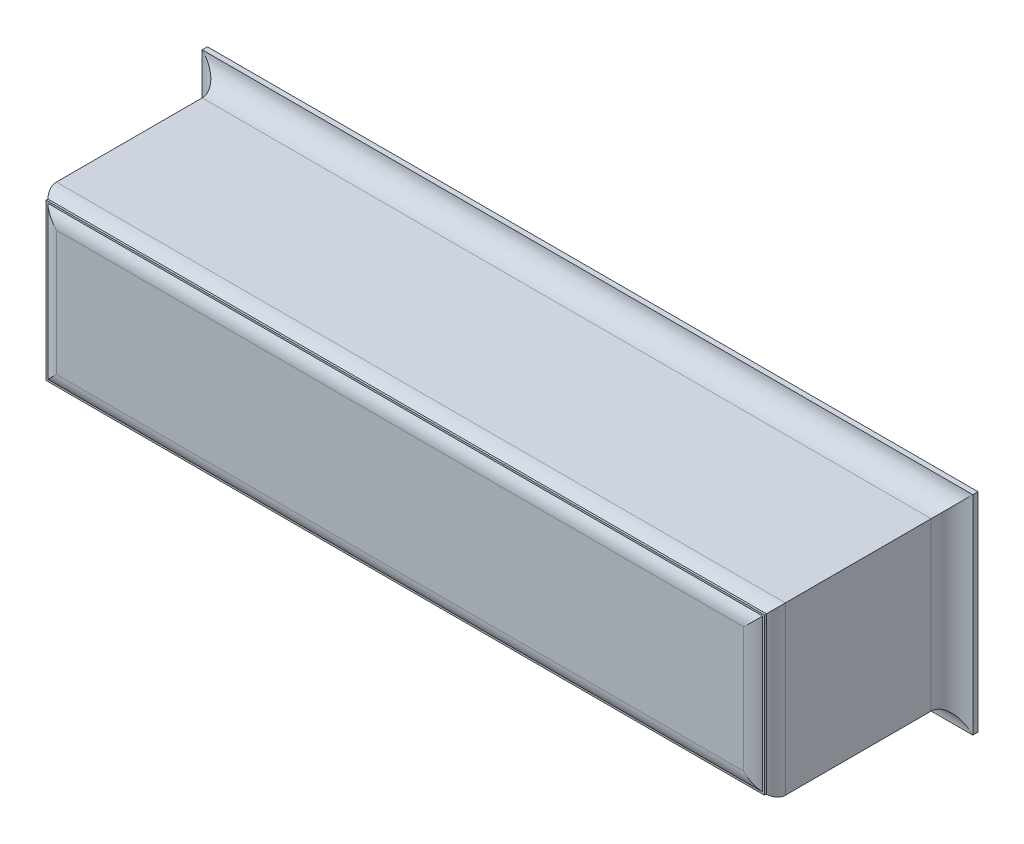
ISO-10303-21;
HEADER;
FILE_DESCRIPTION(('STEP AP214'),'2;1');
FILE_NAME('part.step','',(''),(''),'','','');
FILE_SCHEMA(('AUTOMOTIVE_DESIGN { 1 0 10303 214 1 1 1 1 }'));
ENDSEC;
DATA;
#1=APPLICATION_CONTEXT('core data for automotive mechanical design processes');
#2=APPLICATION_PROTOCOL_DEFINITION('international standard','automotive_design',2000,#1);
#3=PRODUCT_CONTEXT('',#1,'mechanical');
#4=PRODUCT('Part','Part','',(#3));
#5=PRODUCT_RELATED_PRODUCT_CATEGORY('part','',(#4));
#6=PRODUCT_DEFINITION_FORMATION('','',#4);
#7=PRODUCT_DEFINITION_CONTEXT('part definition',#1,'design');
#8=PRODUCT_DEFINITION('design','',#6,#7);
#9=PRODUCT_DEFINITION_SHAPE('','',#8);
#10=(LENGTH_UNIT() NAMED_UNIT(*) SI_UNIT(.MILLI.,.METRE.));
#11=(NAMED_UNIT(*) PLANE_ANGLE_UNIT() SI_UNIT($,.RADIAN.));
#12=(NAMED_UNIT(*) SI_UNIT($,.STERADIAN.) SOLID_ANGLE_UNIT());
#13=UNCERTAINTY_MEASURE_WITH_UNIT(LENGTH_MEASURE(1.E-05),#10,'distance_accuracy_value','');
#14=(GEOMETRIC_REPRESENTATION_CONTEXT(3) GLOBAL_UNCERTAINTY_ASSIGNED_CONTEXT((#13)) GLOBAL_UNIT_ASSIGNED_CONTEXT((#10,
#11,#12)) REPRESENTATION_CONTEXT('',''));
#15=CARTESIAN_POINT('',(0.,0.,0.));
#16=DIRECTION('',(0.,0.,1.));
#17=DIRECTION('',(1.,0.,0.));
#18=AXIS2_PLACEMENT_3D('',#15,#16,#17);
#19=CARTESIAN_POINT('',(234.95,63.5,-3.175));
#20=DIRECTION('',(-1.,0.,0.));
#21=DIRECTION('',(0.,-1.,0.));
#22=AXIS2_PLACEMENT_3D('',#19,#20,#21);
#23=PLANE('',#22);
#24=DIRECTION('',(0.,-1.,0.));
#25=VECTOR('',#24,1.);
#26=CARTESIAN_POINT('',(234.95,63.5,0.));
#27=LINE('',#26,#25);
#28=CARTESIAN_POINT('',(234.95,63.5,0.));
#29=VERTEX_POINT('',#28);
#30=CARTESIAN_POINT('',(234.95,-63.5000000000001,0.));
#31=VERTEX_POINT('',#30);
#32=EDGE_CURVE('E207',#29,#31,#27,.T.);
#33=ORIENTED_EDGE('',*,*,#32,.T.);
#34=DIRECTION('',(0.,0.,1.));
#35=VECTOR('',#34,1.);
#36=CARTESIAN_POINT('',(234.95,-63.5000000000001,-3.175));
#37=LINE('',#36,#35);
#38=CARTESIAN_POINT('',(234.95,-63.5000000000001,-3.175));
#39=VERTEX_POINT('',#38);
#40=EDGE_CURVE('E223',#39,#31,#37,.T.);
#41=ORIENTED_EDGE('',*,*,#40,.F.);
#42=DIRECTION('',(0.,-1.,0.));
#43=VECTOR('',#42,1.);
#44=CARTESIAN_POINT('',(234.95,63.5,-3.175));
#45=LINE('',#44,#43);
#46=CARTESIAN_POINT('',(234.95,63.5,-3.175));
#47=VERTEX_POINT('',#46);
#48=EDGE_CURVE('E196',#47,#39,#45,.T.);
#49=ORIENTED_EDGE('',*,*,#48,.F.);
#50=DIRECTION('',(0.,0.,1.));
#51=VECTOR('',#50,1.);
#52=CARTESIAN_POINT('',(234.95,63.5,-3.175));
#53=LINE('',#52,#51);
#54=EDGE_CURVE('E206',#47,#29,#53,.T.);
#55=ORIENTED_EDGE('',*,*,#54,.T.);
#56=EDGE_LOOP('',(#33,#41,#49,#55));
#57=FACE_BOUND('',#56,.T.);
#58=ADVANCED_FACE('F36',(#57),#23,.F.);
#59=CARTESIAN_POINT('',(-234.95,-63.5,-3.175));
#60=DIRECTION('',(0.,1.,0.));
#61=DIRECTION('',(-1.,0.,0.));
#62=AXIS2_PLACEMENT_3D('',#59,#60,#61);
#63=PLANE('',#62);
#64=DIRECTION('',(-1.,0.,0.));
#65=VECTOR('',#64,1.);
#66=CARTESIAN_POINT('',(-234.95,-63.5,0.));
#67=LINE('',#66,#65);
#68=CARTESIAN_POINT('',(-234.95,-63.5,0.));
#69=VERTEX_POINT('',#68);
#70=EDGE_CURVE('E210',#31,#69,#67,.T.);
#71=ORIENTED_EDGE('',*,*,#70,.T.);
#72=DIRECTION('',(0.,0.,1.));
#73=VECTOR('',#72,1.);
#74=CARTESIAN_POINT('',(-234.95,-63.5,-3.175));
#75=LINE('',#74,#73);
#76=CARTESIAN_POINT('',(-234.95,-63.5,-3.175));
#77=VERTEX_POINT('',#76);
#78=EDGE_CURVE('E220',#77,#69,#75,.T.);
#79=ORIENTED_EDGE('',*,*,#78,.F.);
#80=DIRECTION('',(-1.,0.,0.));
#81=VECTOR('',#80,1.);
#82=CARTESIAN_POINT('',(-234.95,-63.5,-3.175));
#83=LINE('',#82,#81);
#84=EDGE_CURVE('E199',#39,#77,#83,.T.);
#85=ORIENTED_EDGE('',*,*,#84,.F.);
#86=ORIENTED_EDGE('',*,*,#40,.T.);
#87=EDGE_LOOP('',(#71,#79,#85,#86));
#88=FACE_BOUND('',#87,.T.);
#89=ADVANCED_FACE('F330',(#88),#63,.F.);
#90=CARTESIAN_POINT('',(-234.95,63.5,-3.175));
#91=DIRECTION('',(1.,0.,0.));
#92=DIRECTION('',(0.,1.,0.));
#93=AXIS2_PLACEMENT_3D('',#90,#91,#92);
#94=PLANE('',#93);
#95=DIRECTION('',(0.,1.,0.));
#96=VECTOR('',#95,1.);
#97=CARTESIAN_POINT('',(-234.95,63.5,0.));
#98=LINE('',#97,#96);
#99=CARTESIAN_POINT('',(-234.95,63.5,0.));
#100=VERTEX_POINT('',#99);
#101=EDGE_CURVE('E212',#69,#100,#98,.T.);
#102=ORIENTED_EDGE('',*,*,#101,.T.);
#103=DIRECTION('',(0.,0.,1.));
#104=VECTOR('',#103,1.);
#105=CARTESIAN_POINT('',(-234.95,63.5,-3.175));
#106=LINE('',#105,#104);
#107=CARTESIAN_POINT('',(-234.95,63.5,-3.175));
#108=VERTEX_POINT('',#107);
#109=EDGE_CURVE('E217',#108,#100,#106,.T.);
#110=ORIENTED_EDGE('',*,*,#109,.F.);
#111=DIRECTION('',(0.,1.,0.));
#112=VECTOR('',#111,1.);
#113=CARTESIAN_POINT('',(-234.95,63.5,-3.175));
#114=LINE('',#113,#112);
#115=EDGE_CURVE('E202',#77,#108,#114,.T.);
#116=ORIENTED_EDGE('',*,*,#115,.F.);
#117=ORIENTED_EDGE('',*,*,#78,.T.);
#118=EDGE_LOOP('',(#102,#110,#116,#117));
#119=FACE_BOUND('',#118,.T.);
#120=ADVANCED_FACE('F318',(#119),#94,.F.);
#121=CARTESIAN_POINT('',(-234.95,63.5,-3.175));
#122=DIRECTION('',(0.,-1.,0.));
#123=DIRECTION('',(1.,0.,0.));
#124=AXIS2_PLACEMENT_3D('',#121,#122,#123);
#125=PLANE('',#124);
#126=DIRECTION('',(1.,0.,0.));
#127=VECTOR('',#126,1.);
#128=CARTESIAN_POINT('',(-234.95,63.5,0.));
#129=LINE('',#128,#127);
#130=EDGE_CURVE('E200',#100,#29,#129,.T.);
#131=ORIENTED_EDGE('',*,*,#130,.T.);
#132=ORIENTED_EDGE('',*,*,#54,.F.);
#133=DIRECTION('',(1.,0.,0.));
#134=VECTOR('',#133,1.);
#135=CARTESIAN_POINT('',(-234.95,63.5,-3.175));
#136=LINE('',#135,#134);
#137=EDGE_CURVE('E204',#108,#47,#136,.T.);
#138=ORIENTED_EDGE('',*,*,#137,.F.);
#139=ORIENTED_EDGE('',*,*,#109,.T.);
#140=EDGE_LOOP('',(#131,#132,#138,#139));
#141=FACE_BOUND('',#140,.T.);
#142=ADVANCED_FACE('F323',(#141),#125,.F.);
#143=CARTESIAN_POINT('',(0.,0.,-3.175));
#144=DIRECTION('',(0.,0.,1.));
#145=DIRECTION('',(1.,0.,0.));
#146=AXIS2_PLACEMENT_3D('',#143,#144,#145);
#147=PLANE('',#146);
#148=ORIENTED_EDGE('',*,*,#48,.T.);
#149=ORIENTED_EDGE('',*,*,#84,.T.);
#150=ORIENTED_EDGE('',*,*,#115,.T.);
#151=ORIENTED_EDGE('',*,*,#137,.T.);
#152=EDGE_LOOP('',(#148,#149,#150,#151));
#153=FACE_BOUND('',#152,.T.);
#154=ADVANCED_FACE('F327',(#153),#147,.F.);
#155=CARTESIAN_POINT('',(222.25,-50.8,57.15));
#156=DIRECTION('',(0.,1.,0.));
#157=DIRECTION('',(-1.,0.,0.));
#158=AXIS2_PLACEMENT_3D('',#155,#156,#157);
#159=PLANE('',#158);
#160=DIRECTION('',(0.,0.,-1.));
#161=VECTOR('',#160,1.);
#162=CARTESIAN_POINT('',(-222.25,-50.8,57.15));
#163=LINE('',#162,#161);
#164=CARTESIAN_POINT('',(-222.25,-50.8,101.6));
#165=VERTEX_POINT('',#164);
#166=CARTESIAN_POINT('',(-222.25,-50.8,12.7));
#167=VERTEX_POINT('',#166);
#168=EDGE_CURVE('E265',#165,#167,#163,.T.);
#169=ORIENTED_EDGE('',*,*,#168,.T.);
#170=DIRECTION('',(1.,0.,0.));
#171=VECTOR('',#170,1.);
#172=CARTESIAN_POINT('',(222.25,-50.8,12.7));
#173=LINE('',#172,#171);
#174=CARTESIAN_POINT('',(222.25,-50.8,12.7));
#175=VERTEX_POINT('',#174);
#176=EDGE_CURVE('E11',#167,#175,#173,.T.);
#177=ORIENTED_EDGE('',*,*,#176,.T.);
#178=DIRECTION('',(0.,0.,-1.));
#179=VECTOR('',#178,1.);
#180=CARTESIAN_POINT('',(222.25,-50.8,57.15));
#181=LINE('',#180,#179);
#182=CARTESIAN_POINT('',(222.25,-50.8,101.6));
#183=VERTEX_POINT('',#182);
#184=EDGE_CURVE('E262',#183,#175,#181,.T.);
#185=ORIENTED_EDGE('',*,*,#184,.F.);
#186=DIRECTION('',(1.,0.,0.));
#187=VECTOR('',#186,1.);
#188=CARTESIAN_POINT('',(-222.25,-50.8,101.6));
#189=LINE('',#188,#187);
#190=EDGE_CURVE('E276',#183,#165,#189,.F.);
#191=ORIENTED_EDGE('',*,*,#190,.T.);
#192=EDGE_LOOP('',(#169,#177,#185,#191));
#193=FACE_BOUND('',#192,.T.);
#194=ADVANCED_FACE('F364',(#193),#159,.F.);
#195=CARTESIAN_POINT('',(222.25,-50.8,57.15));
#196=DIRECTION('',(-1.,0.,0.));
#197=DIRECTION('',(0.,0.,1.));
#198=AXIS2_PLACEMENT_3D('',#195,#196,#197);
#199=PLANE('',#198);
#200=ORIENTED_EDGE('',*,*,#184,.T.);
#201=DIRECTION('',(0.,1.,0.));
#202=VECTOR('',#201,1.);
#203=CARTESIAN_POINT('',(222.25,-50.8,12.7));
#204=LINE('',#203,#202);
#205=CARTESIAN_POINT('',(222.25,50.8,12.7));
#206=VERTEX_POINT('',#205);
#207=EDGE_CURVE('E285',#175,#206,#204,.T.);
#208=ORIENTED_EDGE('',*,*,#207,.T.);
#209=DIRECTION('',(0.,0.,-1.));
#210=VECTOR('',#209,1.);
#211=CARTESIAN_POINT('',(222.25,50.8,57.15));
#212=LINE('',#211,#210);
#213=CARTESIAN_POINT('',(222.25,50.8,101.6));
#214=VERTEX_POINT('',#213);
#215=EDGE_CURVE('E260',#214,#206,#212,.T.);
#216=ORIENTED_EDGE('',*,*,#215,.F.);
#217=DIRECTION('',(0.,-1.,0.));
#218=VECTOR('',#217,1.);
#219=CARTESIAN_POINT('',(222.25,-50.8,101.6));
#220=LINE('',#219,#218);
#221=EDGE_CURVE('E283',#214,#183,#220,.T.);
#222=ORIENTED_EDGE('',*,*,#221,.T.);
#223=EDGE_LOOP('',(#200,#208,#216,#222));
#224=FACE_BOUND('',#223,.T.);
#225=ADVANCED_FACE('F340',(#224),#199,.F.);
#226=CARTESIAN_POINT('',(222.25,50.8,57.15));
#227=DIRECTION('',(0.,-1.,0.));
#228=DIRECTION('',(1.,0.,0.));
#229=AXIS2_PLACEMENT_3D('',#226,#227,#228);
#230=PLANE('',#229);
#231=ORIENTED_EDGE('',*,*,#215,.T.);
#232=DIRECTION('',(-1.,0.,0.));
#233=VECTOR('',#232,1.);
#234=CARTESIAN_POINT('',(222.25,50.8,12.7));
#235=LINE('',#234,#233);
#236=CARTESIAN_POINT('',(-222.25,50.8,12.7));
#237=VERTEX_POINT('',#236);
#238=EDGE_CURVE('E61',#206,#237,#235,.T.);
#239=ORIENTED_EDGE('',*,*,#238,.T.);
#240=DIRECTION('',(0.,0.,-1.));
#241=VECTOR('',#240,1.);
#242=CARTESIAN_POINT('',(-222.25,50.8,57.15));
#243=LINE('',#242,#241);
#244=CARTESIAN_POINT('',(-222.25,50.8,101.6));
#245=VERTEX_POINT('',#244);
#246=EDGE_CURVE('E230',#245,#237,#243,.T.);
#247=ORIENTED_EDGE('',*,*,#246,.F.);
#248=DIRECTION('',(1.,0.,0.));
#249=VECTOR('',#248,1.);
#250=CARTESIAN_POINT('',(222.25,50.8,101.6));
#251=LINE('',#250,#249);
#252=EDGE_CURVE('E281',#245,#214,#251,.T.);
#253=ORIENTED_EDGE('',*,*,#252,.T.);
#254=EDGE_LOOP('',(#231,#239,#247,#253));
#255=FACE_BOUND('',#254,.T.);
#256=ADVANCED_FACE('F343',(#255),#230,.F.);
#257=CARTESIAN_POINT('',(-222.25,-50.8,57.15));
#258=DIRECTION('',(1.,0.,0.));
#259=DIRECTION('',(0.,0.,-1.));
#260=AXIS2_PLACEMENT_3D('',#257,#258,#259);
#261=PLANE('',#260);
#262=ORIENTED_EDGE('',*,*,#246,.T.);
#263=DIRECTION('',(0.,-1.,0.));
#264=VECTOR('',#263,1.);
#265=CARTESIAN_POINT('',(-222.25,-50.8,12.7));
#266=LINE('',#265,#264);
#267=EDGE_CURVE('E46',#237,#167,#266,.T.);
#268=ORIENTED_EDGE('',*,*,#267,.T.);
#269=ORIENTED_EDGE('',*,*,#168,.F.);
#270=DIRECTION('',(0.,1.,0.));
#271=VECTOR('',#270,1.);
#272=CARTESIAN_POINT('',(-222.25,50.8,101.6));
#273=LINE('',#272,#271);
#274=EDGE_CURVE('E279',#165,#245,#273,.T.);
#275=ORIENTED_EDGE('',*,*,#274,.T.);
#276=EDGE_LOOP('',(#262,#268,#269,#275));
#277=FACE_BOUND('',#276,.T.);
#278=ADVANCED_FACE('F412',(#277),#261,.F.);
#279=CARTESIAN_POINT('',(-338.820504416855,0.,114.3));
#280=DIRECTION('',(0.,0.,1.));
#281=DIRECTION('',(1.,0.,0.));
#282=AXIS2_PLACEMENT_3D('',#279,#280,#281);
#283=PLANE('',#282);
#284=DIRECTION('',(0.,1.,0.));
#285=VECTOR('',#284,1.);
#286=CARTESIAN_POINT('',(-209.55,-50.8,114.3));
#287=LINE('',#286,#285);
#288=CARTESIAN_POINT('',(-209.55,38.1,114.3));
#289=VERTEX_POINT('',#288);
#290=CARTESIAN_POINT('',(-209.55,-38.1,114.3));
#291=VERTEX_POINT('',#290);
#292=EDGE_CURVE('E271',#289,#291,#287,.F.);
#293=ORIENTED_EDGE('',*,*,#292,.T.);
#294=DIRECTION('',(1.,0.,0.));
#295=VECTOR('',#294,1.);
#296=CARTESIAN_POINT('',(222.25,-38.1,114.3));
#297=LINE('',#296,#295);
#298=CARTESIAN_POINT('',(209.55,-38.1,114.3));
#299=VERTEX_POINT('',#298);
#300=EDGE_CURVE('E273',#291,#299,#297,.T.);
#301=ORIENTED_EDGE('',*,*,#300,.T.);
#302=DIRECTION('',(0.,-1.,0.));
#303=VECTOR('',#302,1.);
#304=CARTESIAN_POINT('',(209.55,50.8,114.3));
#305=LINE('',#304,#303);
#306=CARTESIAN_POINT('',(209.55,38.1,114.3));
#307=VERTEX_POINT('',#306);
#308=EDGE_CURVE('E267',#299,#307,#305,.F.);
#309=ORIENTED_EDGE('',*,*,#308,.T.);
#310=DIRECTION('',(1.,0.,0.));
#311=VECTOR('',#310,1.);
#312=CARTESIAN_POINT('',(-222.25,38.1,114.3));
#313=LINE('',#312,#311);
#314=EDGE_CURVE('E269',#307,#289,#313,.F.);
#315=ORIENTED_EDGE('',*,*,#314,.T.);
#316=EDGE_LOOP('',(#293,#301,#309,#315));
#317=FACE_BOUND('',#316,.T.);
#318=ADVANCED_FACE('F357',(#317),#283,.T.);
#319=CARTESIAN_POINT('',(222.25,38.1,101.6));
#320=DIRECTION('',(-1.,0.,0.));
#321=DIRECTION('',(0.,-1.,0.));
#322=AXIS2_PLACEMENT_3D('',#319,#320,#321);
#323=CYLINDRICAL_SURFACE('',#322,12.7);
#324=CARTESIAN_POINT('',(209.55,38.1,101.6));
#325=DIRECTION('',(-0.707106781186548,0.707106781186547,0.));
#326=DIRECTION('',(0.707106781186547,0.707106781186548,0.));
#327=AXIS2_PLACEMENT_3D('',#324,#325,#326);
#328=ELLIPSE('',#327,17.9605122421383,12.7);
#329=EDGE_CURVE('E290',#214,#307,#328,.F.);
#330=ORIENTED_EDGE('',*,*,#329,.F.);
#331=ORIENTED_EDGE('',*,*,#252,.F.);
#332=CARTESIAN_POINT('',(-209.55,38.1,101.6));
#333=DIRECTION('',(-0.707106781186547,-0.707106781186548,0.));
#334=DIRECTION('',(-0.707106781186548,0.707106781186547,0.));
#335=AXIS2_PLACEMENT_3D('',#332,#333,#334);
#336=ELLIPSE('',#335,17.9605122421383,12.7);
#337=EDGE_CURVE('E182',#289,#245,#336,.T.);
#338=ORIENTED_EDGE('',*,*,#337,.F.);
#339=ORIENTED_EDGE('',*,*,#314,.F.);
#340=EDGE_LOOP('',(#330,#331,#338,#339));
#341=FACE_BOUND('',#340,.T.);
#342=ADVANCED_FACE('F347',(#341),#323,.T.);
#343=CARTESIAN_POINT('',(-209.55,-50.8,101.6));
#344=DIRECTION('',(0.,-1.,0.));
#345=DIRECTION('',(0.,0.,-1.));
#346=AXIS2_PLACEMENT_3D('',#343,#344,#345);
#347=CYLINDRICAL_SURFACE('',#346,12.7);
#348=ORIENTED_EDGE('',*,*,#337,.T.);
#349=ORIENTED_EDGE('',*,*,#274,.F.);
#350=CARTESIAN_POINT('',(-209.55,-38.1,101.6));
#351=DIRECTION('',(0.707106781186548,-0.707106781186547,0.));
#352=DIRECTION('',(-0.707106781186547,-0.707106781186548,0.));
#353=AXIS2_PLACEMENT_3D('',#350,#351,#352);
#354=ELLIPSE('',#353,17.9605122421383,12.7);
#355=EDGE_CURVE('E288',#291,#165,#354,.T.);
#356=ORIENTED_EDGE('',*,*,#355,.F.);
#357=ORIENTED_EDGE('',*,*,#292,.F.);
#358=EDGE_LOOP('',(#348,#349,#356,#357));
#359=FACE_BOUND('',#358,.T.);
#360=ADVANCED_FACE('F353',(#359),#347,.T.);
#361=CARTESIAN_POINT('',(209.55,-50.8,101.6));
#362=DIRECTION('',(0.,1.,0.));
#363=DIRECTION('',(0.,0.,1.));
#364=AXIS2_PLACEMENT_3D('',#361,#362,#363);
#365=CYLINDRICAL_SURFACE('',#364,12.7);
#366=ORIENTED_EDGE('',*,*,#329,.T.);
#367=ORIENTED_EDGE('',*,*,#308,.F.);
#368=CARTESIAN_POINT('',(209.55,-38.1,101.6));
#369=DIRECTION('',(0.707106781186547,0.707106781186548,0.));
#370=DIRECTION('',(-0.707106781186548,0.707106781186547,0.));
#371=AXIS2_PLACEMENT_3D('',#368,#369,#370);
#372=ELLIPSE('',#371,17.9605122421383,12.7);
#373=EDGE_CURVE('E286',#183,#299,#372,.F.);
#374=ORIENTED_EDGE('',*,*,#373,.F.);
#375=ORIENTED_EDGE('',*,*,#221,.F.);
#376=EDGE_LOOP('',(#366,#367,#374,#375));
#377=FACE_BOUND('',#376,.T.);
#378=ADVANCED_FACE('F360',(#377),#365,.T.);
#379=CARTESIAN_POINT('',(-338.820504416855,-38.1,101.6));
#380=DIRECTION('',(-1.,0.,0.));
#381=DIRECTION('',(0.,-1.,0.));
#382=AXIS2_PLACEMENT_3D('',#379,#380,#381);
#383=CYLINDRICAL_SURFACE('',#382,12.7);
#384=ORIENTED_EDGE('',*,*,#355,.T.);
#385=ORIENTED_EDGE('',*,*,#190,.F.);
#386=ORIENTED_EDGE('',*,*,#373,.T.);
#387=ORIENTED_EDGE('',*,*,#300,.F.);
#388=EDGE_LOOP('',(#384,#385,#386,#387));
#389=FACE_BOUND('',#388,.T.);
#390=ADVANCED_FACE('F366',(#389),#383,.T.);
#391=CARTESIAN_POINT('',(-234.95,-50.8,12.7));
#392=DIRECTION('',(0.,-1.,0.));
#393=DIRECTION('',(0.,0.,-1.));
#394=AXIS2_PLACEMENT_3D('',#391,#392,#393);
#395=CYLINDRICAL_SURFACE('',#394,12.7);
#396=CARTESIAN_POINT('',(-234.95,63.5,12.7));
#397=DIRECTION('',(-0.707106781186547,-0.707106781186548,0.));
#398=DIRECTION('',(0.707106781186548,-0.707106781186547,0.));
#399=AXIS2_PLACEMENT_3D('',#396,#397,#398);
#400=ELLIPSE('',#399,17.9605122421383,12.7);
#401=EDGE_CURVE('E302',#100,#237,#400,.T.);
#402=ORIENTED_EDGE('',*,*,#401,.F.);
#403=ORIENTED_EDGE('',*,*,#101,.F.);
#404=CARTESIAN_POINT('',(-234.95,-63.5,12.7));
#405=DIRECTION('',(0.707106781186548,-0.707106781186547,0.));
#406=DIRECTION('',(0.707106781186547,0.707106781186548,0.));
#407=AXIS2_PLACEMENT_3D('',#404,#405,#406);
#408=ELLIPSE('',#407,17.9605122421383,12.7);
#409=EDGE_CURVE('E40',#167,#69,#408,.F.);
#410=ORIENTED_EDGE('',*,*,#409,.F.);
#411=ORIENTED_EDGE('',*,*,#267,.F.);
#412=EDGE_LOOP('',(#402,#403,#410,#411));
#413=FACE_BOUND('',#412,.T.);
#414=ADVANCED_FACE('F38',(#413),#395,.F.);
#415=CARTESIAN_POINT('',(222.25,-63.5,12.7));
#416=DIRECTION('',(1.,0.,0.));
#417=DIRECTION('',(0.,1.,0.));
#418=AXIS2_PLACEMENT_3D('',#415,#416,#417);
#419=CYLINDRICAL_SURFACE('',#418,12.7);
#420=ORIENTED_EDGE('',*,*,#409,.T.);
#421=ORIENTED_EDGE('',*,*,#70,.F.);
#422=CARTESIAN_POINT('',(234.95,-63.5,12.7));
#423=DIRECTION('',(0.707106781186547,0.707106781186548,0.));
#424=DIRECTION('',(0.707106781186548,-0.707106781186547,0.));
#425=AXIS2_PLACEMENT_3D('',#422,#423,#424);
#426=ELLIPSE('',#425,17.9605122421383,12.7);
#427=EDGE_CURVE('E301',#175,#31,#426,.F.);
#428=ORIENTED_EDGE('',*,*,#427,.F.);
#429=ORIENTED_EDGE('',*,*,#176,.F.);
#430=EDGE_LOOP('',(#420,#421,#428,#429));
#431=FACE_BOUND('',#430,.T.);
#432=ADVANCED_FACE('F312',(#431),#419,.F.);
#433=CARTESIAN_POINT('',(222.25,63.5,12.7));
#434=DIRECTION('',(-1.,0.,0.));
#435=DIRECTION('',(0.,-1.,0.));
#436=AXIS2_PLACEMENT_3D('',#433,#434,#435);
#437=CYLINDRICAL_SURFACE('',#436,12.7);
#438=ORIENTED_EDGE('',*,*,#401,.T.);
#439=ORIENTED_EDGE('',*,*,#238,.F.);
#440=CARTESIAN_POINT('',(234.95,63.5,12.7));
#441=DIRECTION('',(-0.707106781186548,0.707106781186547,0.));
#442=DIRECTION('',(-0.707106781186547,-0.707106781186548,0.));
#443=AXIS2_PLACEMENT_3D('',#440,#441,#442);
#444=ELLIPSE('',#443,17.9605122421383,12.7);
#445=EDGE_CURVE('E299',#29,#206,#444,.T.);
#446=ORIENTED_EDGE('',*,*,#445,.F.);
#447=ORIENTED_EDGE('',*,*,#130,.F.);
#448=EDGE_LOOP('',(#438,#439,#446,#447));
#449=FACE_BOUND('',#448,.T.);
#450=ADVANCED_FACE('F337',(#449),#437,.F.);
#451=CARTESIAN_POINT('',(234.95,-50.8,12.7));
#452=DIRECTION('',(0.,1.,0.));
#453=DIRECTION('',(0.,0.,1.));
#454=AXIS2_PLACEMENT_3D('',#451,#452,#453);
#455=CYLINDRICAL_SURFACE('',#454,12.7);
#456=ORIENTED_EDGE('',*,*,#427,.T.);
#457=ORIENTED_EDGE('',*,*,#32,.F.);
#458=ORIENTED_EDGE('',*,*,#445,.T.);
#459=ORIENTED_EDGE('',*,*,#207,.F.);
#460=EDGE_LOOP('',(#456,#457,#458,#459));
#461=FACE_BOUND('',#460,.T.);
#462=ADVANCED_FACE('F335',(#461),#455,.F.);
#463=CLOSED_SHELL('',(#58,#89,#120,#142,#154,#194,#225,#256,#278,#318,#342,#360,#378,#390,#414,
#432,#450,#462));
#464=CARTESIAN_POINT('',(-219.075,-50.8,57.15));
#465=DIRECTION('',(1.,0.,0.));
#466=DIRECTION('',(0.,0.,-1.));
#467=AXIS2_PLACEMENT_3D('',#464,#465,#466);
#468=PLANE('',#467);
#469=DIRECTION('',(0.,-1.,0.));
#470=VECTOR('',#469,1.);
#471=CARTESIAN_POINT('',(-219.075,-50.8,0.));
#472=LINE('',#471,#470);
#473=CARTESIAN_POINT('',(-219.075,47.625,0.));
#474=VERTEX_POINT('',#473);
#475=CARTESIAN_POINT('',(-219.075,-47.625,0.));
#476=VERTEX_POINT('',#475);
#477=EDGE_CURVE('E226',#474,#476,#472,.T.);
#478=ORIENTED_EDGE('',*,*,#477,.F.);
#479=DIRECTION('',(0.,0.,-1.));
#480=VECTOR('',#479,1.);
#481=CARTESIAN_POINT('',(-219.075,47.625,57.15));
#482=LINE('',#481,#480);
#483=CARTESIAN_POINT('',(-219.075,47.625,53.975));
#484=VERTEX_POINT('',#483);
#485=EDGE_CURVE('E237',#484,#474,#482,.T.);
#486=ORIENTED_EDGE('',*,*,#485,.F.);
#487=DIRECTION('',(0.,-1.,0.));
#488=VECTOR('',#487,1.);
#489=CARTESIAN_POINT('',(-219.075,-50.8,53.975));
#490=LINE('',#489,#488);
#491=CARTESIAN_POINT('',(-219.075,-47.625,53.975));
#492=VERTEX_POINT('',#491);
#493=EDGE_CURVE('E232',#484,#492,#490,.T.);
#494=ORIENTED_EDGE('',*,*,#493,.T.);
#495=DIRECTION('',(0.,0.,-1.));
#496=VECTOR('',#495,1.);
#497=CARTESIAN_POINT('',(-219.075,-47.625,57.15));
#498=LINE('',#497,#496);
#499=EDGE_CURVE('E227',#492,#476,#498,.T.);
#500=ORIENTED_EDGE('',*,*,#499,.T.);
#501=EDGE_LOOP('',(#478,#486,#494,#500));
#502=FACE_BOUND('',#501,.T.);
#503=ADVANCED_FACE('F383',(#502),#468,.T.);
#504=CARTESIAN_POINT('',(222.25,-47.625,57.15));
#505=DIRECTION('',(0.,1.,0.));
#506=DIRECTION('',(-1.,0.,0.));
#507=AXIS2_PLACEMENT_3D('',#504,#505,#506);
#508=PLANE('',#507);
#509=DIRECTION('',(1.,0.,0.));
#510=VECTOR('',#509,1.);
#511=CARTESIAN_POINT('',(222.25,-47.625,0.));
#512=LINE('',#511,#510);
#513=CARTESIAN_POINT('',(219.075,-47.625,0.));
#514=VERTEX_POINT('',#513);
#515=EDGE_CURVE('E251',#476,#514,#512,.T.);
#516=ORIENTED_EDGE('',*,*,#515,.F.);
#517=ORIENTED_EDGE('',*,*,#499,.F.);
#518=DIRECTION('',(1.,0.,0.));
#519=VECTOR('',#518,1.);
#520=CARTESIAN_POINT('',(222.25,-47.625,53.975));
#521=LINE('',#520,#519);
#522=CARTESIAN_POINT('',(219.075,-47.625,53.975));
#523=VERTEX_POINT('',#522);
#524=EDGE_CURVE('E235',#492,#523,#521,.T.);
#525=ORIENTED_EDGE('',*,*,#524,.T.);
#526=DIRECTION('',(0.,0.,-1.));
#527=VECTOR('',#526,1.);
#528=CARTESIAN_POINT('',(219.075,-47.625,57.15));
#529=LINE('',#528,#527);
#530=EDGE_CURVE('E231',#523,#514,#529,.T.);
#531=ORIENTED_EDGE('',*,*,#530,.T.);
#532=EDGE_LOOP('',(#516,#517,#525,#531));
#533=FACE_BOUND('',#532,.T.);
#534=ADVANCED_FACE('F386',(#533),#508,.T.);
#535=CARTESIAN_POINT('',(219.075,-50.8,57.15));
#536=DIRECTION('',(-1.,0.,0.));
#537=DIRECTION('',(0.,0.,1.));
#538=AXIS2_PLACEMENT_3D('',#535,#536,#537);
#539=PLANE('',#538);
#540=DIRECTION('',(0.,1.,0.));
#541=VECTOR('',#540,1.);
#542=CARTESIAN_POINT('',(219.075,-50.8,0.));
#543=LINE('',#542,#541);
#544=CARTESIAN_POINT('',(219.075,47.625,0.));
#545=VERTEX_POINT('',#544);
#546=EDGE_CURVE('E254',#514,#545,#543,.T.);
#547=ORIENTED_EDGE('',*,*,#546,.F.);
#548=ORIENTED_EDGE('',*,*,#530,.F.);
#549=DIRECTION('',(0.,1.,0.));
#550=VECTOR('',#549,1.);
#551=CARTESIAN_POINT('',(219.075,-50.8,53.975));
#552=LINE('',#551,#550);
#553=CARTESIAN_POINT('',(219.075,47.625,53.975));
#554=VERTEX_POINT('',#553);
#555=EDGE_CURVE('E244',#523,#554,#552,.T.);
#556=ORIENTED_EDGE('',*,*,#555,.T.);
#557=DIRECTION('',(0.,0.,-1.));
#558=VECTOR('',#557,1.);
#559=CARTESIAN_POINT('',(219.075,47.625,57.15));
#560=LINE('',#559,#558);
#561=EDGE_CURVE('E239',#554,#545,#560,.T.);
#562=ORIENTED_EDGE('',*,*,#561,.T.);
#563=EDGE_LOOP('',(#547,#548,#556,#562));
#564=FACE_BOUND('',#563,.T.);
#565=ADVANCED_FACE('F391',(#564),#539,.T.);
#566=CARTESIAN_POINT('',(222.25,47.625,57.15));
#567=DIRECTION('',(0.,-1.,0.));
#568=DIRECTION('',(1.,0.,0.));
#569=AXIS2_PLACEMENT_3D('',#566,#567,#568);
#570=PLANE('',#569);
#571=DIRECTION('',(-1.,0.,0.));
#572=VECTOR('',#571,1.);
#573=CARTESIAN_POINT('',(222.25,47.625,0.));
#574=LINE('',#573,#572);
#575=EDGE_CURVE('E236',#545,#474,#574,.T.);
#576=ORIENTED_EDGE('',*,*,#575,.F.);
#577=ORIENTED_EDGE('',*,*,#561,.F.);
#578=DIRECTION('',(-1.,0.,0.));
#579=VECTOR('',#578,1.);
#580=CARTESIAN_POINT('',(222.25,47.625,53.975));
#581=LINE('',#580,#579);
#582=EDGE_CURVE('E240',#554,#484,#581,.T.);
#583=ORIENTED_EDGE('',*,*,#582,.T.);
#584=ORIENTED_EDGE('',*,*,#485,.T.);
#585=EDGE_LOOP('',(#576,#577,#583,#584));
#586=FACE_BOUND('',#585,.T.);
#587=ADVANCED_FACE('F395',(#586),#570,.T.);
#588=CARTESIAN_POINT('',(0.,0.,53.975));
#589=DIRECTION('',(0.,0.,1.));
#590=DIRECTION('',(1.,0.,0.));
#591=AXIS2_PLACEMENT_3D('',#588,#589,#590);
#592=PLANE('',#591);
#593=ORIENTED_EDGE('',*,*,#493,.F.);
#594=ORIENTED_EDGE('',*,*,#582,.F.);
#595=ORIENTED_EDGE('',*,*,#555,.F.);
#596=ORIENTED_EDGE('',*,*,#524,.F.);
#597=EDGE_LOOP('',(#593,#594,#595,#596));
#598=FACE_BOUND('',#597,.T.);
#599=ADVANCED_FACE('F399',(#598),#592,.F.);
#600=CARTESIAN_POINT('',(0.,0.,0.));
#601=DIRECTION('',(0.,0.,1.));
#602=DIRECTION('',(1.,0.,0.));
#603=AXIS2_PLACEMENT_3D('',#600,#601,#602);
#604=PLANE('',#603);
#605=ORIENTED_EDGE('',*,*,#546,.T.);
#606=ORIENTED_EDGE('',*,*,#575,.T.);
#607=ORIENTED_EDGE('',*,*,#477,.T.);
#608=ORIENTED_EDGE('',*,*,#515,.T.);
#609=EDGE_LOOP('',(#605,#606,#607,#608));
#610=FACE_BOUND('',#609,.T.);
#611=ADVANCED_FACE('F403',(#610),#604,.T.);
#612=CLOSED_SHELL('',(#503,#534,#565,#587,#599,#611));
#613=CARTESIAN_POINT('',(-219.075,0.,0.));
#614=DIRECTION('',(-1.,0.,0.));
#615=DIRECTION('',(0.,0.,1.));
#616=AXIS2_PLACEMENT_3D('',#613,#614,#615);
#617=PLANE('',#616);
#618=DIRECTION('',(0.,-1.,0.));
#619=VECTOR('',#618,1.);
#620=CARTESIAN_POINT('',(-219.075,47.625,57.15));
#621=LINE('',#620,#619);
#622=CARTESIAN_POINT('',(-219.075,47.625,57.15));
#623=VERTEX_POINT('',#622);
#624=CARTESIAN_POINT('',(-219.075,-47.625,57.15));
#625=VERTEX_POINT('',#624);
#626=EDGE_CURVE('E167',#623,#625,#621,.T.);
#627=ORIENTED_EDGE('',*,*,#626,.F.);
#628=DIRECTION('',(0.,0.,-1.));
#629=VECTOR('',#628,1.);
#630=CARTESIAN_POINT('',(-219.075,47.625,57.15));
#631=LINE('',#630,#629);
#632=CARTESIAN_POINT('',(-219.075,47.625,111.125));
#633=VERTEX_POINT('',#632);
#634=EDGE_CURVE('E664',#633,#623,#631,.T.);
#635=ORIENTED_EDGE('',*,*,#634,.F.);
#636=DIRECTION('',(0.,1.,0.));
#637=VECTOR('',#636,1.);
#638=CARTESIAN_POINT('',(-219.075,47.625,111.125));
#639=LINE('',#638,#637);
#640=CARTESIAN_POINT('',(-219.075,-47.625,111.125));
#641=VERTEX_POINT('',#640);
#642=EDGE_CURVE('E170',#641,#633,#639,.T.);
#643=ORIENTED_EDGE('',*,*,#642,.F.);
#644=DIRECTION('',(0.,0.,1.));
#645=VECTOR('',#644,1.);
#646=CARTESIAN_POINT('',(-219.075,-47.625,57.15));
#647=LINE('',#646,#645);
#648=EDGE_CURVE('E164',#625,#641,#647,.T.);
#649=ORIENTED_EDGE('',*,*,#648,.F.);
#650=EDGE_LOOP('',(#627,#635,#643,#649));
#651=FACE_BOUND('',#650,.T.);
#652=ADVANCED_FACE('F166',(#651),#617,.F.);
#653=CARTESIAN_POINT('',(219.075,0.,0.));
#654=DIRECTION('',(1.,0.,0.));
#655=DIRECTION('',(0.,0.,-1.));
#656=AXIS2_PLACEMENT_3D('',#653,#654,#655);
#657=PLANE('',#656);
#658=DIRECTION('',(0.,1.,0.));
#659=VECTOR('',#658,1.);
#660=CARTESIAN_POINT('',(219.075,0.,111.125));
#661=LINE('',#660,#659);
#662=CARTESIAN_POINT('',(219.075,-47.625,111.125));
#663=VERTEX_POINT('',#662);
#664=CARTESIAN_POINT('',(219.075,47.625,111.125));
#665=VERTEX_POINT('',#664);
#666=EDGE_CURVE('E670',#663,#665,#661,.T.);
#667=ORIENTED_EDGE('',*,*,#666,.T.);
#668=DIRECTION('',(0.,0.,-1.));
#669=VECTOR('',#668,1.);
#670=CARTESIAN_POINT('',(219.075,47.625,0.));
#671=LINE('',#670,#669);
#672=CARTESIAN_POINT('',(219.075,47.625,57.15));
#673=VERTEX_POINT('',#672);
#674=EDGE_CURVE('E192',#665,#673,#671,.T.);
#675=ORIENTED_EDGE('',*,*,#674,.T.);
#676=DIRECTION('',(0.,1.,0.));
#677=VECTOR('',#676,1.);
#678=CARTESIAN_POINT('',(219.075,-50.8,57.15));
#679=LINE('',#678,#677);
#680=CARTESIAN_POINT('',(219.075,-47.625,57.15));
#681=VERTEX_POINT('',#680);
#682=EDGE_CURVE('E673',#681,#673,#679,.T.);
#683=ORIENTED_EDGE('',*,*,#682,.F.);
#684=DIRECTION('',(0.,0.,-1.));
#685=VECTOR('',#684,1.);
#686=CARTESIAN_POINT('',(219.075,-47.625,0.));
#687=LINE('',#686,#685);
#688=EDGE_CURVE('E187',#663,#681,#687,.T.);
#689=ORIENTED_EDGE('',*,*,#688,.F.);
#690=EDGE_LOOP('',(#667,#675,#683,#689));
#691=FACE_BOUND('',#690,.T.);
#692=ADVANCED_FACE('F535',(#691),#657,.F.);
#693=CARTESIAN_POINT('',(-338.820504416855,-47.625,0.));
#694=DIRECTION('',(0.,1.,0.));
#695=DIRECTION('',(0.,0.,1.));
#696=AXIS2_PLACEMENT_3D('',#693,#694,#695);
#697=PLANE('',#696);
#698=DIRECTION('',(1.,0.,0.));
#699=VECTOR('',#698,1.);
#700=CARTESIAN_POINT('',(-338.820504416855,-47.625,57.15));
#701=LINE('',#700,#699);
#702=EDGE_CURVE('E179',#625,#681,#701,.T.);
#703=ORIENTED_EDGE('',*,*,#702,.F.);
#704=ORIENTED_EDGE('',*,*,#648,.T.);
#705=DIRECTION('',(1.,0.,0.));
#706=VECTOR('',#705,1.);
#707=CARTESIAN_POINT('',(-338.820504416855,-47.625,111.125));
#708=LINE('',#707,#706);
#709=EDGE_CURVE('E188',#641,#663,#708,.T.);
#710=ORIENTED_EDGE('',*,*,#709,.T.);
#711=ORIENTED_EDGE('',*,*,#688,.T.);
#712=EDGE_LOOP('',(#703,#704,#710,#711));
#713=FACE_BOUND('',#712,.T.);
#714=ADVANCED_FACE('F185',(#713),#697,.T.);
#715=CARTESIAN_POINT('',(-338.820504416855,0.,111.125));
#716=DIRECTION('',(0.,0.,1.));
#717=DIRECTION('',(0.,-1.,0.));
#718=AXIS2_PLACEMENT_3D('',#715,#716,#717);
#719=PLANE('',#718);
#720=ORIENTED_EDGE('',*,*,#642,.T.);
#721=DIRECTION('',(1.,0.,0.));
#722=VECTOR('',#721,1.);
#723=CARTESIAN_POINT('',(-338.820504416855,47.625,111.125));
#724=LINE('',#723,#722);
#725=EDGE_CURVE('E190',#633,#665,#724,.T.);
#726=ORIENTED_EDGE('',*,*,#725,.T.);
#727=ORIENTED_EDGE('',*,*,#666,.F.);
#728=ORIENTED_EDGE('',*,*,#709,.F.);
#729=EDGE_LOOP('',(#720,#726,#727,#728));
#730=FACE_BOUND('',#729,.T.);
#731=ADVANCED_FACE('F430',(#730),#719,.F.);
#732=CARTESIAN_POINT('',(-338.820504416855,47.625,0.));
#733=DIRECTION('',(0.,1.,0.));
#734=DIRECTION('',(0.,0.,1.));
#735=AXIS2_PLACEMENT_3D('',#732,#733,#734);
#736=PLANE('',#735);
#737=ORIENTED_EDGE('',*,*,#634,.T.);
#738=DIRECTION('',(1.,0.,0.));
#739=VECTOR('',#738,1.);
#740=CARTESIAN_POINT('',(-338.820504416855,47.625,57.15));
#741=LINE('',#740,#739);
#742=EDGE_CURVE('E181',#623,#673,#741,.T.);
#743=ORIENTED_EDGE('',*,*,#742,.T.);
#744=ORIENTED_EDGE('',*,*,#674,.F.);
#745=ORIENTED_EDGE('',*,*,#725,.F.);
#746=EDGE_LOOP('',(#737,#743,#744,#745));
#747=FACE_BOUND('',#746,.T.);
#748=ADVANCED_FACE('F407',(#747),#736,.F.);
#749=CARTESIAN_POINT('',(0.,0.,57.15));
#750=DIRECTION('',(0.,0.,1.));
#751=DIRECTION('',(1.,0.,0.));
#752=AXIS2_PLACEMENT_3D('',#749,#750,#751);
#753=PLANE('',#752);
#754=ORIENTED_EDGE('',*,*,#742,.F.);
#755=ORIENTED_EDGE('',*,*,#626,.T.);
#756=ORIENTED_EDGE('',*,*,#702,.T.);
#757=ORIENTED_EDGE('',*,*,#682,.T.);
#758=EDGE_LOOP('',(#754,#755,#756,#757));
#759=FACE_BOUND('',#758,.T.);
#760=ADVANCED_FACE('F177',(#759),#753,.T.);
#761=CLOSED_SHELL('',(#652,#692,#714,#731,#748,#760));
#762=ORIENTED_CLOSED_SHELL('',*,#612,.T.);
#763=ORIENTED_CLOSED_SHELL('',*,#761,.T.);
#764=BREP_WITH_VOIDS('B2',#463,(#762,#763));
#765=ADVANCED_BREP_SHAPE_REPRESENTATION('',(#18,#764),#14);
#766=SHAPE_DEFINITION_REPRESENTATION(#9,#765);
ENDSEC;
END-ISO-10303-21;
